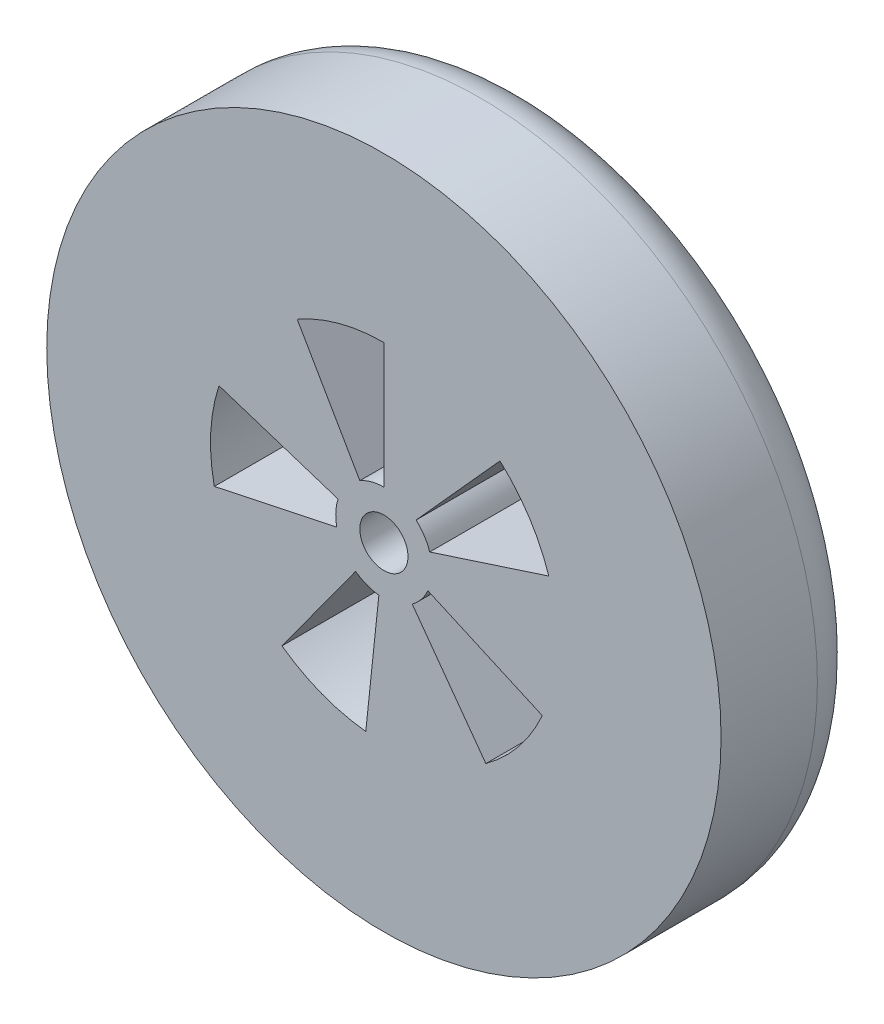
ISO-10303-21;
HEADER;
FILE_DESCRIPTION(('STEP AP214'),'2;1');
FILE_NAME('part.step','',(''),(''),'','','');
FILE_SCHEMA(('AUTOMOTIVE_DESIGN { 1 0 10303 214 1 1 1 1 }'));
ENDSEC;
DATA;
#1=APPLICATION_CONTEXT('core data for automotive mechanical design processes');
#2=APPLICATION_PROTOCOL_DEFINITION('international standard','automotive_design',2000,#1);
#3=PRODUCT_CONTEXT('',#1,'mechanical');
#4=PRODUCT('Part','Part','',(#3));
#5=PRODUCT_RELATED_PRODUCT_CATEGORY('part','',(#4));
#6=PRODUCT_DEFINITION_FORMATION('','',#4);
#7=PRODUCT_DEFINITION_CONTEXT('part definition',#1,'design');
#8=PRODUCT_DEFINITION('design','',#6,#7);
#9=PRODUCT_DEFINITION_SHAPE('','',#8);
#10=(LENGTH_UNIT() NAMED_UNIT(*) SI_UNIT(.MILLI.,.METRE.));
#11=(NAMED_UNIT(*) PLANE_ANGLE_UNIT() SI_UNIT($,.RADIAN.));
#12=(NAMED_UNIT(*) SI_UNIT($,.STERADIAN.) SOLID_ANGLE_UNIT());
#13=UNCERTAINTY_MEASURE_WITH_UNIT(LENGTH_MEASURE(1.E-05),#10,'distance_accuracy_value','');
#14=(GEOMETRIC_REPRESENTATION_CONTEXT(3) GLOBAL_UNCERTAINTY_ASSIGNED_CONTEXT((#13)) GLOBAL_UNIT_ASSIGNED_CONTEXT((#10,
#11,#12)) REPRESENTATION_CONTEXT('',''));
#15=CARTESIAN_POINT('',(0.,0.,0.));
#16=DIRECTION('',(0.,0.,1.));
#17=DIRECTION('',(1.,0.,0.));
#18=AXIS2_PLACEMENT_3D('',#15,#16,#17);
#19=CARTESIAN_POINT('',(0.,0.,15.));
#20=DIRECTION('',(0.,0.,-1.));
#21=DIRECTION('',(-1.,0.,0.));
#22=AXIS2_PLACEMENT_3D('',#19,#20,#21);
#23=CYLINDRICAL_SURFACE('',#22,35.);
#24=CARTESIAN_POINT('',(0.,0.,5.));
#25=DIRECTION('',(0.,0.,1.));
#26=DIRECTION('',(1.,0.,0.));
#27=AXIS2_PLACEMENT_3D('',#24,#25,#26);
#28=CIRCLE('',#27,35.);
#29=CARTESIAN_POINT('',(35.,0.,5.));
#30=VERTEX_POINT('',#29);
#31=EDGE_CURVE('E40',#30,#30,#28,.T.);
#32=ORIENTED_EDGE('',*,*,#31,.T.);
#33=EDGE_LOOP('',(#32));
#34=FACE_BOUND('',#33,.T.);
#35=CARTESIAN_POINT('',(0.,0.,15.));
#36=DIRECTION('',(0.,0.,1.));
#37=DIRECTION('',(1.,0.,0.));
#38=AXIS2_PLACEMENT_3D('',#35,#36,#37);
#39=CIRCLE('',#38,35.);
#40=CARTESIAN_POINT('',(35.,0.,15.));
#41=VERTEX_POINT('',#40);
#42=EDGE_CURVE('E345',#41,#41,#39,.T.);
#43=ORIENTED_EDGE('',*,*,#42,.F.);
#44=EDGE_LOOP('',(#43));
#45=FACE_BOUND('',#44,.T.);
#46=ADVANCED_FACE('F32',(#34,#45),#23,.T.);
#47=CARTESIAN_POINT('',(0.,0.,15.));
#48=DIRECTION('',(0.,0.,1.));
#49=DIRECTION('',(1.,0.,0.));
#50=AXIS2_PLACEMENT_3D('',#47,#48,#49);
#51=PLANE('',#50);
#52=CARTESIAN_POINT('',(0.,0.,15.));
#53=DIRECTION('',(0.,0.,1.));
#54=DIRECTION('',(1.,0.,0.));
#55=AXIS2_PLACEMENT_3D('',#52,#53,#54);
#56=CIRCLE('',#55,5.);
#57=CARTESIAN_POINT('',(4.75528258147575,1.54508497187479,15.));
#58=VERTEX_POINT('',#57);
#59=CARTESIAN_POINT('',(3.34565303179425,3.71572412738701,15.));
#60=VERTEX_POINT('',#59);
#61=EDGE_CURVE('E277',#58,#60,#56,.T.);
#62=ORIENTED_EDGE('',*,*,#61,.T.);
#63=DIRECTION('',(0.669130606358849,0.743144825477403,0.));
#64=VECTOR('',#63,1.);
#65=CARTESIAN_POINT('',(3.34565303179425,3.71572412738701,15.));
#66=LINE('',#65,#64);
#67=CARTESIAN_POINT('',(12.0443509144593,13.3766068585932,15.));
#68=VERTEX_POINT('',#67);
#69=EDGE_CURVE('E280',#60,#68,#66,.T.);
#70=ORIENTED_EDGE('',*,*,#69,.T.);
#71=CARTESIAN_POINT('',(0.,0.,15.));
#72=DIRECTION('',(0.,0.,-1.));
#73=DIRECTION('',(1.,0.,0.));
#74=AXIS2_PLACEMENT_3D('',#71,#72,#73);
#75=CIRCLE('',#74,18.);
#76=CARTESIAN_POINT('',(17.1190172933127,5.56230589874925,15.));
#77=VERTEX_POINT('',#76);
#78=EDGE_CURVE('E47',#68,#77,#75,.T.);
#79=ORIENTED_EDGE('',*,*,#78,.T.);
#80=DIRECTION('',(-0.95105651629515,-0.309016994374958,0.));
#81=VECTOR('',#80,1.);
#82=CARTESIAN_POINT('',(4.75528258147575,1.54508497187479,15.));
#83=LINE('',#82,#81);
#84=EDGE_CURVE('E285',#77,#58,#83,.T.);
#85=ORIENTED_EDGE('',*,*,#84,.T.);
#86=EDGE_LOOP('',(#62,#70,#79,#85));
#87=FACE_BOUND('',#86,.T.);
#88=CARTESIAN_POINT('',(0.,0.,15.));
#89=DIRECTION('',(0.,0.,1.));
#90=DIRECTION('',(1.,0.,0.));
#91=AXIS2_PLACEMENT_3D('',#88,#89,#90);
#92=CIRCLE('',#91,5.);
#93=CARTESIAN_POINT('',(2.9389262614624,-4.04508497187471,15.));
#94=VERTEX_POINT('',#93);
#95=CARTESIAN_POINT('',(4.56772728821303,-2.03368321537896,15.));
#96=VERTEX_POINT('',#95);
#97=EDGE_CURVE('E248',#94,#96,#92,.T.);
#98=ORIENTED_EDGE('',*,*,#97,.T.);
#99=DIRECTION('',(0.913545457642605,-0.406736643075791,0.));
#100=VECTOR('',#99,1.);
#101=CARTESIAN_POINT('',(4.56772728821303,-2.03368321537896,15.));
#102=LINE('',#101,#100);
#103=CARTESIAN_POINT('',(16.4438182375669,-7.32125957536424,15.));
#104=VERTEX_POINT('',#103);
#105=EDGE_CURVE('E251',#96,#104,#102,.T.);
#106=ORIENTED_EDGE('',*,*,#105,.T.);
#107=CARTESIAN_POINT('',(0.,0.,15.));
#108=DIRECTION('',(0.,0.,-1.));
#109=DIRECTION('',(1.,0.,0.));
#110=AXIS2_PLACEMENT_3D('',#107,#108,#109);
#111=CIRCLE('',#110,18.);
#112=CARTESIAN_POINT('',(10.5801345412646,-14.562305898749,15.));
#113=VERTEX_POINT('',#112);
#114=EDGE_CURVE('E55',#104,#113,#111,.T.);
#115=ORIENTED_EDGE('',*,*,#114,.T.);
#116=DIRECTION('',(-0.58778525229248,0.809016994374942,0.));
#117=VECTOR('',#116,1.);
#118=CARTESIAN_POINT('',(2.9389262614624,-4.04508497187471,15.));
#119=LINE('',#118,#117);
#120=EDGE_CURVE('E256',#113,#94,#119,.T.);
#121=ORIENTED_EDGE('',*,*,#120,.T.);
#122=EDGE_LOOP('',(#98,#106,#115,#121));
#123=FACE_BOUND('',#122,.T.);
#124=CARTESIAN_POINT('',(0.,0.,15.));
#125=DIRECTION('',(0.,0.,1.));
#126=DIRECTION('',(1.,0.,0.));
#127=AXIS2_PLACEMENT_3D('',#124,#125,#126);
#128=CIRCLE('',#127,5.);
#129=CARTESIAN_POINT('',(-2.93892626146234,-4.04508497187476,15.));
#130=VERTEX_POINT('',#129);
#131=CARTESIAN_POINT('',(-0.522642316338235,-4.97260947684137,15.));
#132=VERTEX_POINT('',#131);
#133=EDGE_CURVE('E216',#130,#132,#128,.T.);
#134=ORIENTED_EDGE('',*,*,#133,.T.);
#135=DIRECTION('',(-0.104528463267647,-0.994521895368274,0.));
#136=VECTOR('',#135,1.);
#137=CARTESIAN_POINT('',(-0.522642316338235,-4.97260947684137,15.));
#138=LINE('',#137,#136);
#139=CARTESIAN_POINT('',(-1.88151233881764,-17.9013941166289,15.));
#140=VERTEX_POINT('',#139);
#141=EDGE_CURVE('E219',#132,#140,#138,.T.);
#142=ORIENTED_EDGE('',*,*,#141,.T.);
#143=CARTESIAN_POINT('',(0.,0.,15.));
#144=DIRECTION('',(0.,0.,-1.));
#145=DIRECTION('',(1.,0.,0.));
#146=AXIS2_PLACEMENT_3D('',#143,#144,#145);
#147=CIRCLE('',#146,18.);
#148=CARTESIAN_POINT('',(-10.5801345412644,-14.5623058987491,15.));
#149=VERTEX_POINT('',#148);
#150=EDGE_CURVE('E223',#140,#149,#147,.T.);
#151=ORIENTED_EDGE('',*,*,#150,.T.);
#152=DIRECTION('',(0.587785252292469,0.809016994374951,0.));
#153=VECTOR('',#152,1.);
#154=CARTESIAN_POINT('',(-2.93892626146234,-4.04508497187476,15.));
#155=LINE('',#154,#153);
#156=EDGE_CURVE('E226',#149,#130,#155,.T.);
#157=ORIENTED_EDGE('',*,*,#156,.T.);
#158=EDGE_LOOP('',(#134,#142,#151,#157));
#159=FACE_BOUND('',#158,.T.);
#160=CARTESIAN_POINT('',(0.,0.,15.));
#161=DIRECTION('',(0.,0.,1.));
#162=DIRECTION('',(1.,0.,0.));
#163=AXIS2_PLACEMENT_3D('',#160,#161,#162);
#164=CIRCLE('',#163,5.);
#165=CARTESIAN_POINT('',(-4.75528258147577,1.54508497187472,15.));
#166=VERTEX_POINT('',#165);
#167=CARTESIAN_POINT('',(-4.89073800366903,-1.03955845408882,15.));
#168=VERTEX_POINT('',#167);
#169=EDGE_CURVE('E175',#166,#168,#164,.T.);
#170=ORIENTED_EDGE('',*,*,#169,.T.);
#171=DIRECTION('',(-0.978147600733805,-0.207911690817763,0.));
#172=VECTOR('',#171,1.);
#173=CARTESIAN_POINT('',(-4.89073800366903,-1.03955845408882,15.));
#174=LINE('',#173,#172);
#175=CARTESIAN_POINT('',(-17.6066568132085,-3.74241043471974,15.));
#176=VERTEX_POINT('',#175);
#177=EDGE_CURVE('E186',#168,#176,#174,.T.);
#178=ORIENTED_EDGE('',*,*,#177,.T.);
#179=CARTESIAN_POINT('',(0.,0.,15.));
#180=DIRECTION('',(0.,0.,-1.));
#181=DIRECTION('',(1.,0.,0.));
#182=AXIS2_PLACEMENT_3D('',#179,#180,#181);
#183=CIRCLE('',#182,18.);
#184=CARTESIAN_POINT('',(-17.1190172933128,5.56230589874901,15.));
#185=VERTEX_POINT('',#184);
#186=EDGE_CURVE('E191',#176,#185,#183,.T.);
#187=ORIENTED_EDGE('',*,*,#186,.T.);
#188=DIRECTION('',(0.951056516295154,-0.309016994374945,0.));
#189=VECTOR('',#188,1.);
#190=CARTESIAN_POINT('',(-4.75528258147577,1.54508497187472,15.));
#191=LINE('',#190,#189);
#192=EDGE_CURVE('E182',#185,#166,#191,.T.);
#193=ORIENTED_EDGE('',*,*,#192,.T.);
#194=EDGE_LOOP('',(#170,#178,#187,#193));
#195=FACE_BOUND('',#194,.T.);
#196=CARTESIAN_POINT('',(0.,0.,15.));
#197=DIRECTION('',(0.,0.,1.));
#198=DIRECTION('',(1.,0.,0.));
#199=AXIS2_PLACEMENT_3D('',#196,#197,#198);
#200=CIRCLE('',#199,5.);
#201=CARTESIAN_POINT('',(0.,5.,15.));
#202=VERTEX_POINT('',#201);
#203=CARTESIAN_POINT('',(-2.5,4.33012701892219,15.));
#204=VERTEX_POINT('',#203);
#205=EDGE_CURVE('E305',#202,#204,#200,.T.);
#206=ORIENTED_EDGE('',*,*,#205,.T.);
#207=DIRECTION('',(-0.500000000000001,0.866025403784438,0.));
#208=VECTOR('',#207,1.);
#209=CARTESIAN_POINT('',(-2.5,4.33012701892219,15.));
#210=LINE('',#209,#208);
#211=CARTESIAN_POINT('',(-9.00000000000002,15.5884572681199,15.));
#212=VERTEX_POINT('',#211);
#213=EDGE_CURVE('E308',#204,#212,#210,.T.);
#214=ORIENTED_EDGE('',*,*,#213,.T.);
#215=CARTESIAN_POINT('',(0.,0.,15.));
#216=DIRECTION('',(0.,0.,-1.));
#217=DIRECTION('',(1.,0.,0.));
#218=AXIS2_PLACEMENT_3D('',#215,#216,#217);
#219=CIRCLE('',#218,18.);
#220=CARTESIAN_POINT('',(0.,18.,15.));
#221=VERTEX_POINT('',#220);
#222=EDGE_CURVE('E312',#212,#221,#219,.T.);
#223=ORIENTED_EDGE('',*,*,#222,.T.);
#224=DIRECTION('',(0.,-1.,0.));
#225=VECTOR('',#224,1.);
#226=CARTESIAN_POINT('',(0.,5.,15.));
#227=LINE('',#226,#225);
#228=EDGE_CURVE('E315',#221,#202,#227,.T.);
#229=ORIENTED_EDGE('',*,*,#228,.T.);
#230=EDGE_LOOP('',(#206,#214,#223,#229));
#231=FACE_BOUND('',#230,.T.);
#232=CARTESIAN_POINT('',(0.,0.,15.));
#233=DIRECTION('',(0.,0.,-1.));
#234=DIRECTION('',(-1.,0.,0.));
#235=AXIS2_PLACEMENT_3D('',#232,#233,#234);
#236=CIRCLE('',#235,2.5);
#237=CARTESIAN_POINT('',(-2.5,0.,15.));
#238=VERTEX_POINT('',#237);
#239=EDGE_CURVE('E337',#238,#238,#236,.T.);
#240=ORIENTED_EDGE('',*,*,#239,.T.);
#241=EDGE_LOOP('',(#240));
#242=FACE_BOUND('',#241,.T.);
#243=ORIENTED_EDGE('',*,*,#42,.T.);
#244=EDGE_LOOP('',(#243));
#245=FACE_BOUND('',#244,.T.);
#246=ADVANCED_FACE('F193',(#87,#123,#159,#195,#231,#242,#245),#51,.T.);
#247=CARTESIAN_POINT('',(0.,0.,0.));
#248=DIRECTION('',(0.,0.,1.));
#249=DIRECTION('',(1.,0.,0.));
#250=AXIS2_PLACEMENT_3D('',#247,#248,#249);
#251=PLANE('',#250);
#252=CARTESIAN_POINT('',(0.,0.,0.));
#253=DIRECTION('',(0.,0.,1.));
#254=DIRECTION('',(1.,0.,0.));
#255=AXIS2_PLACEMENT_3D('',#252,#253,#254);
#256=CIRCLE('',#255,30.);
#257=CARTESIAN_POINT('',(30.,0.,0.));
#258=VERTEX_POINT('',#257);
#259=EDGE_CURVE('E11',#258,#258,#256,.F.);
#260=ORIENTED_EDGE('',*,*,#259,.T.);
#261=EDGE_LOOP('',(#260));
#262=FACE_BOUND('',#261,.T.);
#263=CARTESIAN_POINT('',(0.,0.,0.));
#264=DIRECTION('',(0.,0.,-1.));
#265=DIRECTION('',(-1.,0.,0.));
#266=AXIS2_PLACEMENT_3D('',#263,#264,#265);
#267=CIRCLE('',#266,20.);
#268=CARTESIAN_POINT('',(-20.,0.,0.));
#269=VERTEX_POINT('',#268);
#270=EDGE_CURVE('E340',#269,#269,#267,.T.);
#271=ORIENTED_EDGE('',*,*,#270,.F.);
#272=EDGE_LOOP('',(#271));
#273=FACE_BOUND('',#272,.T.);
#274=ADVANCED_FACE('F377',(#262,#273),#251,.F.);
#275=CARTESIAN_POINT('',(0.,0.,3.));
#276=DIRECTION('',(0.,0.,-1.));
#277=DIRECTION('',(-1.,0.,0.));
#278=AXIS2_PLACEMENT_3D('',#275,#276,#277);
#279=CYLINDRICAL_SURFACE('',#278,20.);
#280=CARTESIAN_POINT('',(0.,0.,1.));
#281=DIRECTION('',(0.,0.,-1.));
#282=DIRECTION('',(-1.,0.,0.));
#283=AXIS2_PLACEMENT_3D('',#280,#281,#282);
#284=CIRCLE('',#283,20.);
#285=CARTESIAN_POINT('',(-20.,0.,1.));
#286=VERTEX_POINT('',#285);
#287=EDGE_CURVE('E352',#286,#286,#284,.F.);
#288=ORIENTED_EDGE('',*,*,#287,.T.);
#289=EDGE_LOOP('',(#288));
#290=FACE_BOUND('',#289,.T.);
#291=ORIENTED_EDGE('',*,*,#270,.T.);
#292=EDGE_LOOP('',(#291));
#293=FACE_BOUND('',#292,.T.);
#294=ADVANCED_FACE('F393',(#290,#293),#279,.F.);
#295=CARTESIAN_POINT('',(0.,0.,3.));
#296=DIRECTION('',(0.,0.,-1.));
#297=DIRECTION('',(-1.,0.,0.));
#298=AXIS2_PLACEMENT_3D('',#295,#296,#297);
#299=PLANE('',#298);
#300=DIRECTION('',(-0.95105651629515,-0.309016994374958,0.));
#301=VECTOR('',#300,1.);
#302=CARTESIAN_POINT('',(4.75528258147575,1.54508497187479,3.));
#303=LINE('',#302,#301);
#304=CARTESIAN_POINT('',(17.1190172933127,5.56230589874925,3.));
#305=VERTEX_POINT('',#304);
#306=CARTESIAN_POINT('',(4.75528258147575,1.54508497187479,3.));
#307=VERTEX_POINT('',#306);
#308=EDGE_CURVE('E281',#305,#307,#303,.T.);
#309=ORIENTED_EDGE('',*,*,#308,.F.);
#310=CARTESIAN_POINT('',(0.,0.,3.));
#311=DIRECTION('',(0.,0.,-1.));
#312=DIRECTION('',(-1.,0.,0.));
#313=AXIS2_PLACEMENT_3D('',#310,#311,#312);
#314=CIRCLE('',#313,18.);
#315=CARTESIAN_POINT('',(16.4438182375669,-7.32125957536424,3.));
#316=VERTEX_POINT('',#315);
#317=EDGE_CURVE('E652',#305,#316,#314,.T.);
#318=ORIENTED_EDGE('',*,*,#317,.T.);
#319=DIRECTION('',(0.913545457642605,-0.406736643075791,0.));
#320=VECTOR('',#319,1.);
#321=CARTESIAN_POINT('',(4.56772728821303,-2.03368321537896,3.));
#322=LINE('',#321,#320);
#323=CARTESIAN_POINT('',(4.56772728821303,-2.03368321537896,3.));
#324=VERTEX_POINT('',#323);
#325=EDGE_CURVE('E263',#324,#316,#322,.T.);
#326=ORIENTED_EDGE('',*,*,#325,.F.);
#327=CARTESIAN_POINT('',(0.,0.,3.));
#328=DIRECTION('',(0.,0.,1.));
#329=DIRECTION('',(1.,0.,0.));
#330=AXIS2_PLACEMENT_3D('',#327,#328,#329);
#331=CIRCLE('',#330,5.);
#332=CARTESIAN_POINT('',(2.9389262614624,-4.04508497187471,3.));
#333=VERTEX_POINT('',#332);
#334=EDGE_CURVE('E260',#333,#324,#331,.T.);
#335=ORIENTED_EDGE('',*,*,#334,.F.);
#336=DIRECTION('',(-0.58778525229248,0.809016994374942,0.));
#337=VECTOR('',#336,1.);
#338=CARTESIAN_POINT('',(2.9389262614624,-4.04508497187471,3.));
#339=LINE('',#338,#337);
#340=CARTESIAN_POINT('',(10.5801345412646,-14.562305898749,3.));
#341=VERTEX_POINT('',#340);
#342=EDGE_CURVE('E252',#341,#333,#339,.T.);
#343=ORIENTED_EDGE('',*,*,#342,.F.);
#344=CARTESIAN_POINT('',(-1.88151233881764,-17.9013941166289,3.));
#345=VERTEX_POINT('',#344);
#346=EDGE_CURVE('E654',#341,#345,#314,.T.);
#347=ORIENTED_EDGE('',*,*,#346,.T.);
#348=DIRECTION('',(-0.104528463267647,-0.994521895368274,0.));
#349=VECTOR('',#348,1.);
#350=CARTESIAN_POINT('',(-0.522642316338235,-4.97260947684137,3.));
#351=LINE('',#350,#349);
#352=CARTESIAN_POINT('',(-0.522642316338235,-4.97260947684137,3.));
#353=VERTEX_POINT('',#352);
#354=EDGE_CURVE('E233',#353,#345,#351,.T.);
#355=ORIENTED_EDGE('',*,*,#354,.F.);
#356=CARTESIAN_POINT('',(0.,0.,3.));
#357=DIRECTION('',(0.,0.,1.));
#358=DIRECTION('',(1.,0.,0.));
#359=AXIS2_PLACEMENT_3D('',#356,#357,#358);
#360=CIRCLE('',#359,5.);
#361=CARTESIAN_POINT('',(-2.93892626146234,-4.04508497187476,3.));
#362=VERTEX_POINT('',#361);
#363=EDGE_CURVE('E230',#362,#353,#360,.T.);
#364=ORIENTED_EDGE('',*,*,#363,.F.);
#365=DIRECTION('',(0.587785252292469,0.809016994374951,0.));
#366=VECTOR('',#365,1.);
#367=CARTESIAN_POINT('',(-2.93892626146234,-4.04508497187476,3.));
#368=LINE('',#367,#366);
#369=CARTESIAN_POINT('',(-10.5801345412644,-14.5623058987491,3.));
#370=VERTEX_POINT('',#369);
#371=EDGE_CURVE('E220',#370,#362,#368,.T.);
#372=ORIENTED_EDGE('',*,*,#371,.F.);
#373=CARTESIAN_POINT('',(-17.6066568132085,-3.74241043471974,3.));
#374=VERTEX_POINT('',#373);
#375=EDGE_CURVE('E348',#370,#374,#314,.T.);
#376=ORIENTED_EDGE('',*,*,#375,.T.);
#377=DIRECTION('',(-0.978147600733805,-0.207911690817763,0.));
#378=VECTOR('',#377,1.);
#379=CARTESIAN_POINT('',(-4.89073800366903,-1.03955845408882,3.));
#380=LINE('',#379,#378);
#381=CARTESIAN_POINT('',(-4.89073800366903,-1.03955845408882,3.));
#382=VERTEX_POINT('',#381);
#383=EDGE_CURVE('E205',#382,#374,#380,.T.);
#384=ORIENTED_EDGE('',*,*,#383,.F.);
#385=CARTESIAN_POINT('',(0.,0.,3.));
#386=DIRECTION('',(0.,0.,1.));
#387=DIRECTION('',(1.,0.,0.));
#388=AXIS2_PLACEMENT_3D('',#385,#386,#387);
#389=CIRCLE('',#388,5.);
#390=CARTESIAN_POINT('',(-4.75528258147577,1.54508497187472,3.));
#391=VERTEX_POINT('',#390);
#392=EDGE_CURVE('E178',#391,#382,#389,.T.);
#393=ORIENTED_EDGE('',*,*,#392,.F.);
#394=DIRECTION('',(0.951056516295154,-0.309016994374945,0.));
#395=VECTOR('',#394,1.);
#396=CARTESIAN_POINT('',(-4.75528258147577,1.54508497187472,3.));
#397=LINE('',#396,#395);
#398=CARTESIAN_POINT('',(-17.1190172933128,5.56230589874901,3.));
#399=VERTEX_POINT('',#398);
#400=EDGE_CURVE('E196',#399,#391,#397,.T.);
#401=ORIENTED_EDGE('',*,*,#400,.F.);
#402=CARTESIAN_POINT('',(-9.00000000000002,15.5884572681199,3.));
#403=VERTEX_POINT('',#402);
#404=EDGE_CURVE('E349',#399,#403,#314,.T.);
#405=ORIENTED_EDGE('',*,*,#404,.T.);
#406=DIRECTION('',(-0.500000000000001,0.866025403784438,0.));
#407=VECTOR('',#406,1.);
#408=CARTESIAN_POINT('',(-2.5,4.33012701892219,3.));
#409=LINE('',#408,#407);
#410=CARTESIAN_POINT('',(-2.5,4.33012701892219,3.));
#411=VERTEX_POINT('',#410);
#412=EDGE_CURVE('E321',#411,#403,#409,.T.);
#413=ORIENTED_EDGE('',*,*,#412,.F.);
#414=CARTESIAN_POINT('',(0.,0.,3.));
#415=DIRECTION('',(0.,0.,1.));
#416=DIRECTION('',(1.,0.,0.));
#417=AXIS2_PLACEMENT_3D('',#414,#415,#416);
#418=CIRCLE('',#417,5.);
#419=CARTESIAN_POINT('',(0.,5.,3.));
#420=VERTEX_POINT('',#419);
#421=EDGE_CURVE('E212',#420,#411,#418,.T.);
#422=ORIENTED_EDGE('',*,*,#421,.F.);
#423=DIRECTION('',(0.,-1.,0.));
#424=VECTOR('',#423,1.);
#425=CARTESIAN_POINT('',(0.,5.,3.));
#426=LINE('',#425,#424);
#427=CARTESIAN_POINT('',(0.,18.,3.));
#428=VERTEX_POINT('',#427);
#429=EDGE_CURVE('E309',#428,#420,#426,.T.);
#430=ORIENTED_EDGE('',*,*,#429,.F.);
#431=CARTESIAN_POINT('',(12.0443509144593,13.3766068585932,3.));
#432=VERTEX_POINT('',#431);
#433=EDGE_CURVE('E353',#428,#432,#314,.T.);
#434=ORIENTED_EDGE('',*,*,#433,.T.);
#435=DIRECTION('',(0.669130606358849,0.743144825477403,0.));
#436=VECTOR('',#435,1.);
#437=CARTESIAN_POINT('',(3.34565303179425,3.71572412738701,3.));
#438=LINE('',#437,#436);
#439=CARTESIAN_POINT('',(3.34565303179425,3.71572412738701,3.));
#440=VERTEX_POINT('',#439);
#441=EDGE_CURVE('E292',#440,#432,#438,.T.);
#442=ORIENTED_EDGE('',*,*,#441,.F.);
#443=CARTESIAN_POINT('',(0.,0.,3.));
#444=DIRECTION('',(0.,0.,1.));
#445=DIRECTION('',(1.,0.,0.));
#446=AXIS2_PLACEMENT_3D('',#443,#444,#445);
#447=CIRCLE('',#446,5.);
#448=EDGE_CURVE('E289',#307,#440,#447,.T.);
#449=ORIENTED_EDGE('',*,*,#448,.F.);
#450=EDGE_LOOP('',(#309,#318,#326,#335,#343,#347,#355,#364,#372,#376,#384,#393,#401,#405,#413,
#422,#430,#434,#442,#449));
#451=FACE_BOUND('',#450,.T.);
#452=CARTESIAN_POINT('',(0.,0.,3.));
#453=DIRECTION('',(0.,0.,-1.));
#454=DIRECTION('',(-1.,0.,0.));
#455=AXIS2_PLACEMENT_3D('',#452,#453,#454);
#456=CIRCLE('',#455,2.5);
#457=CARTESIAN_POINT('',(-2.5,0.,3.));
#458=VERTEX_POINT('',#457);
#459=EDGE_CURVE('E330',#458,#458,#456,.T.);
#460=ORIENTED_EDGE('',*,*,#459,.F.);
#461=EDGE_LOOP('',(#460));
#462=FACE_BOUND('',#461,.T.);
#463=ADVANCED_FACE('F384',(#451,#462),#299,.T.);
#464=CARTESIAN_POINT('',(0.,0.,1.));
#465=DIRECTION('',(0.,0.,-1.));
#466=DIRECTION('',(-1.,0.,0.));
#467=AXIS2_PLACEMENT_3D('',#464,#465,#466);
#468=TOROIDAL_SURFACE('',#467,18.,2.);
#469=ORIENTED_EDGE('',*,*,#287,.F.);
#470=EDGE_LOOP('',(#469));
#471=FACE_BOUND('',#470,.T.);
#472=ORIENTED_EDGE('',*,*,#404,.F.);
#473=CARTESIAN_POINT('',(0.,0.,3.));
#474=DIRECTION('',(0.,0.,-1.));
#475=DIRECTION('',(1.,0.,0.));
#476=AXIS2_PLACEMENT_3D('',#473,#474,#475);
#477=CIRCLE('',#476,18.);
#478=EDGE_CURVE('E199',#374,#399,#477,.T.);
#479=ORIENTED_EDGE('',*,*,#478,.F.);
#480=ORIENTED_EDGE('',*,*,#375,.F.);
#481=CARTESIAN_POINT('',(0.,0.,3.));
#482=DIRECTION('',(0.,0.,-1.));
#483=DIRECTION('',(1.,0.,0.));
#484=AXIS2_PLACEMENT_3D('',#481,#482,#483);
#485=CIRCLE('',#484,18.);
#486=EDGE_CURVE('E236',#345,#370,#485,.T.);
#487=ORIENTED_EDGE('',*,*,#486,.F.);
#488=ORIENTED_EDGE('',*,*,#346,.F.);
#489=CARTESIAN_POINT('',(0.,0.,3.));
#490=DIRECTION('',(0.,0.,-1.));
#491=DIRECTION('',(1.,0.,0.));
#492=AXIS2_PLACEMENT_3D('',#489,#490,#491);
#493=CIRCLE('',#492,18.);
#494=EDGE_CURVE('E266',#316,#341,#493,.T.);
#495=ORIENTED_EDGE('',*,*,#494,.F.);
#496=ORIENTED_EDGE('',*,*,#317,.F.);
#497=CARTESIAN_POINT('',(0.,0.,3.));
#498=DIRECTION('',(0.,0.,-1.));
#499=DIRECTION('',(1.,0.,0.));
#500=AXIS2_PLACEMENT_3D('',#497,#498,#499);
#501=CIRCLE('',#500,18.);
#502=EDGE_CURVE('E294',#432,#305,#501,.T.);
#503=ORIENTED_EDGE('',*,*,#502,.F.);
#504=ORIENTED_EDGE('',*,*,#433,.F.);
#505=CARTESIAN_POINT('',(0.,0.,3.));
#506=DIRECTION('',(0.,0.,-1.));
#507=DIRECTION('',(1.,0.,0.));
#508=AXIS2_PLACEMENT_3D('',#505,#506,#507);
#509=CIRCLE('',#508,18.);
#510=EDGE_CURVE('E323',#403,#428,#509,.T.);
#511=ORIENTED_EDGE('',*,*,#510,.F.);
#512=EDGE_LOOP('',(#472,#479,#480,#487,#488,#495,#496,#503,#504,#511));
#513=FACE_BOUND('',#512,.T.);
#514=ADVANCED_FACE('F381',(#471,#513),#468,.F.);
#515=CARTESIAN_POINT('',(0.,0.,15.));
#516=DIRECTION('',(0.,0.,-1.));
#517=DIRECTION('',(-1.,0.,0.));
#518=AXIS2_PLACEMENT_3D('',#515,#516,#517);
#519=CYLINDRICAL_SURFACE('',#518,2.5);
#520=ORIENTED_EDGE('',*,*,#239,.F.);
#521=EDGE_LOOP('',(#520));
#522=FACE_BOUND('',#521,.T.);
#523=ORIENTED_EDGE('',*,*,#459,.T.);
#524=EDGE_LOOP('',(#523));
#525=FACE_BOUND('',#524,.T.);
#526=ADVANCED_FACE('F383',(#522,#525),#519,.F.);
#527=CARTESIAN_POINT('',(0.,0.,15.));
#528=DIRECTION('',(0.,0.,-1.));
#529=DIRECTION('',(-1.,0.,0.));
#530=AXIS2_PLACEMENT_3D('',#527,#528,#529);
#531=CYLINDRICAL_SURFACE('',#530,5.);
#532=ORIENTED_EDGE('',*,*,#421,.T.);
#533=DIRECTION('',(0.,0.,-1.));
#534=VECTOR('',#533,1.);
#535=CARTESIAN_POINT('',(-2.5,4.33012701892219,15.));
#536=LINE('',#535,#534);
#537=EDGE_CURVE('E318',#204,#411,#536,.T.);
#538=ORIENTED_EDGE('',*,*,#537,.F.);
#539=ORIENTED_EDGE('',*,*,#205,.F.);
#540=DIRECTION('',(0.,0.,-1.));
#541=VECTOR('',#540,1.);
#542=CARTESIAN_POINT('',(0.,5.,15.));
#543=LINE('',#542,#541);
#544=EDGE_CURVE('E328',#202,#420,#543,.T.);
#545=ORIENTED_EDGE('',*,*,#544,.T.);
#546=EDGE_LOOP('',(#532,#538,#539,#545));
#547=FACE_BOUND('',#546,.T.);
#548=ADVANCED_FACE('F390',(#547),#531,.T.);
#549=CARTESIAN_POINT('',(0.,5.,15.));
#550=DIRECTION('',(1.,0.,0.));
#551=DIRECTION('',(0.,0.,-1.));
#552=AXIS2_PLACEMENT_3D('',#549,#550,#551);
#553=PLANE('',#552);
#554=ORIENTED_EDGE('',*,*,#429,.T.);
#555=ORIENTED_EDGE('',*,*,#544,.F.);
#556=ORIENTED_EDGE('',*,*,#228,.F.);
#557=DIRECTION('',(0.,0.,-1.));
#558=VECTOR('',#557,1.);
#559=CARTESIAN_POINT('',(0.,18.,15.));
#560=LINE('',#559,#558);
#561=EDGE_CURVE('E331',#221,#428,#560,.T.);
#562=ORIENTED_EDGE('',*,*,#561,.T.);
#563=EDGE_LOOP('',(#554,#555,#556,#562));
#564=FACE_BOUND('',#563,.T.);
#565=ADVANCED_FACE('F466',(#564),#553,.F.);
#566=CARTESIAN_POINT('',(0.,0.,15.));
#567=DIRECTION('',(0.,0.,-1.));
#568=DIRECTION('',(-1.,0.,0.));
#569=AXIS2_PLACEMENT_3D('',#566,#567,#568);
#570=CYLINDRICAL_SURFACE('',#569,18.);
#571=ORIENTED_EDGE('',*,*,#510,.T.);
#572=ORIENTED_EDGE('',*,*,#561,.F.);
#573=ORIENTED_EDGE('',*,*,#222,.F.);
#574=DIRECTION('',(0.,0.,-1.));
#575=VECTOR('',#574,1.);
#576=CARTESIAN_POINT('',(-9.00000000000002,15.5884572681199,15.));
#577=LINE('',#576,#575);
#578=EDGE_CURVE('E333',#212,#403,#577,.T.);
#579=ORIENTED_EDGE('',*,*,#578,.T.);
#580=EDGE_LOOP('',(#571,#572,#573,#579));
#581=FACE_BOUND('',#580,.T.);
#582=ADVANCED_FACE('F469',(#581),#570,.F.);
#583=CARTESIAN_POINT('',(-2.5,4.33012701892219,15.));
#584=DIRECTION('',(-0.866025403784438,-0.500000000000001,0.));
#585=DIRECTION('',(0.500000000000001,-0.866025403784438,0.));
#586=AXIS2_PLACEMENT_3D('',#583,#584,#585);
#587=PLANE('',#586);
#588=ORIENTED_EDGE('',*,*,#412,.T.);
#589=ORIENTED_EDGE('',*,*,#578,.F.);
#590=ORIENTED_EDGE('',*,*,#213,.F.);
#591=ORIENTED_EDGE('',*,*,#537,.T.);
#592=EDGE_LOOP('',(#588,#589,#590,#591));
#593=FACE_BOUND('',#592,.T.);
#594=ADVANCED_FACE('F425',(#593),#587,.F.);
#595=CARTESIAN_POINT('',(0.,0.,15.));
#596=DIRECTION('',(0.,0.,-1.));
#597=DIRECTION('',(-1.,0.,0.));
#598=AXIS2_PLACEMENT_3D('',#595,#596,#597);
#599=CYLINDRICAL_SURFACE('',#598,5.);
#600=ORIENTED_EDGE('',*,*,#392,.T.);
#601=DIRECTION('',(0.,0.,-1.));
#602=VECTOR('',#601,1.);
#603=CARTESIAN_POINT('',(-4.89073800366903,-1.03955845408882,15.));
#604=LINE('',#603,#602);
#605=EDGE_CURVE('E171',#168,#382,#604,.T.);
#606=ORIENTED_EDGE('',*,*,#605,.F.);
#607=ORIENTED_EDGE('',*,*,#169,.F.);
#608=DIRECTION('',(0.,0.,-1.));
#609=VECTOR('',#608,1.);
#610=CARTESIAN_POINT('',(-4.75528258147577,1.54508497187472,15.));
#611=LINE('',#610,#609);
#612=EDGE_CURVE('E210',#166,#391,#611,.T.);
#613=ORIENTED_EDGE('',*,*,#612,.T.);
#614=EDGE_LOOP('',(#600,#606,#607,#613));
#615=FACE_BOUND('',#614,.T.);
#616=ADVANCED_FACE('F173',(#615),#599,.T.);
#617=CARTESIAN_POINT('',(-4.75528258147577,1.54508497187472,15.));
#618=DIRECTION('',(0.309016994374945,0.951056516295154,0.));
#619=DIRECTION('',(-0.951056516295155,0.309016994374945,0.));
#620=AXIS2_PLACEMENT_3D('',#617,#618,#619);
#621=PLANE('',#620);
#622=ORIENTED_EDGE('',*,*,#400,.T.);
#623=ORIENTED_EDGE('',*,*,#612,.F.);
#624=ORIENTED_EDGE('',*,*,#192,.F.);
#625=DIRECTION('',(0.,0.,-1.));
#626=VECTOR('',#625,1.);
#627=CARTESIAN_POINT('',(-17.1190172933128,5.56230589874901,15.));
#628=LINE('',#627,#626);
#629=EDGE_CURVE('E213',#185,#399,#628,.T.);
#630=ORIENTED_EDGE('',*,*,#629,.T.);
#631=EDGE_LOOP('',(#622,#623,#624,#630));
#632=FACE_BOUND('',#631,.T.);
#633=ADVANCED_FACE('F410',(#632),#621,.F.);
#634=CARTESIAN_POINT('',(0.,0.,15.));
#635=DIRECTION('',(0.,0.,-1.));
#636=DIRECTION('',(-1.,0.,0.));
#637=AXIS2_PLACEMENT_3D('',#634,#635,#636);
#638=CYLINDRICAL_SURFACE('',#637,18.);
#639=ORIENTED_EDGE('',*,*,#478,.T.);
#640=ORIENTED_EDGE('',*,*,#629,.F.);
#641=ORIENTED_EDGE('',*,*,#186,.F.);
#642=DIRECTION('',(0.,0.,-1.));
#643=VECTOR('',#642,1.);
#644=CARTESIAN_POINT('',(-17.6066568132085,-3.74241043471973,15.));
#645=LINE('',#644,#643);
#646=EDGE_CURVE('E181',#176,#374,#645,.T.);
#647=ORIENTED_EDGE('',*,*,#646,.T.);
#648=EDGE_LOOP('',(#639,#640,#641,#647));
#649=FACE_BOUND('',#648,.T.);
#650=ADVANCED_FACE('F412',(#649),#638,.F.);
#651=CARTESIAN_POINT('',(-4.89073800366903,-1.03955845408882,15.));
#652=DIRECTION('',(0.207911690817763,-0.978147600733805,0.));
#653=DIRECTION('',(0.978147600733805,0.207911690817763,0.));
#654=AXIS2_PLACEMENT_3D('',#651,#652,#653);
#655=PLANE('',#654);
#656=ORIENTED_EDGE('',*,*,#383,.T.);
#657=ORIENTED_EDGE('',*,*,#646,.F.);
#658=ORIENTED_EDGE('',*,*,#177,.F.);
#659=ORIENTED_EDGE('',*,*,#605,.T.);
#660=EDGE_LOOP('',(#656,#657,#658,#659));
#661=FACE_BOUND('',#660,.T.);
#662=ADVANCED_FACE('F187',(#661),#655,.F.);
#663=CARTESIAN_POINT('',(0.,0.,15.));
#664=DIRECTION('',(0.,0.,-1.));
#665=DIRECTION('',(-1.,0.,0.));
#666=AXIS2_PLACEMENT_3D('',#663,#664,#665);
#667=CYLINDRICAL_SURFACE('',#666,5.);
#668=ORIENTED_EDGE('',*,*,#363,.T.);
#669=DIRECTION('',(0.,0.,-1.));
#670=VECTOR('',#669,1.);
#671=CARTESIAN_POINT('',(-0.522642316338235,-4.97260947684137,15.));
#672=LINE('',#671,#670);
#673=EDGE_CURVE('E229',#132,#353,#672,.T.);
#674=ORIENTED_EDGE('',*,*,#673,.F.);
#675=ORIENTED_EDGE('',*,*,#133,.F.);
#676=DIRECTION('',(0.,0.,-1.));
#677=VECTOR('',#676,1.);
#678=CARTESIAN_POINT('',(-2.93892626146234,-4.04508497187476,15.));
#679=LINE('',#678,#677);
#680=EDGE_CURVE('E206',#130,#362,#679,.T.);
#681=ORIENTED_EDGE('',*,*,#680,.T.);
#682=EDGE_LOOP('',(#668,#674,#675,#681));
#683=FACE_BOUND('',#682,.T.);
#684=ADVANCED_FACE('F419',(#683),#667,.T.);
#685=CARTESIAN_POINT('',(-2.93892626146234,-4.04508497187476,15.));
#686=DIRECTION('',(-0.809016994374951,0.587785252292468,0.));
#687=DIRECTION('',(-0.587785252292469,-0.809016994374951,0.));
#688=AXIS2_PLACEMENT_3D('',#685,#686,#687);
#689=PLANE('',#688);
#690=ORIENTED_EDGE('',*,*,#371,.T.);
#691=ORIENTED_EDGE('',*,*,#680,.F.);
#692=ORIENTED_EDGE('',*,*,#156,.F.);
#693=DIRECTION('',(0.,0.,-1.));
#694=VECTOR('',#693,1.);
#695=CARTESIAN_POINT('',(-10.5801345412644,-14.5623058987491,15.));
#696=LINE('',#695,#694);
#697=EDGE_CURVE('E242',#149,#370,#696,.T.);
#698=ORIENTED_EDGE('',*,*,#697,.T.);
#699=EDGE_LOOP('',(#690,#691,#692,#698));
#700=FACE_BOUND('',#699,.T.);
#701=ADVANCED_FACE('F426',(#700),#689,.F.);
#702=CARTESIAN_POINT('',(0.,0.,15.));
#703=DIRECTION('',(0.,0.,-1.));
#704=DIRECTION('',(-1.,0.,0.));
#705=AXIS2_PLACEMENT_3D('',#702,#703,#704);
#706=CYLINDRICAL_SURFACE('',#705,18.);
#707=ORIENTED_EDGE('',*,*,#486,.T.);
#708=ORIENTED_EDGE('',*,*,#697,.F.);
#709=ORIENTED_EDGE('',*,*,#150,.F.);
#710=DIRECTION('',(0.,0.,-1.));
#711=VECTOR('',#710,1.);
#712=CARTESIAN_POINT('',(-1.88151233881765,-17.9013941166289,15.));
#713=LINE('',#712,#711);
#714=EDGE_CURVE('E244',#140,#345,#713,.T.);
#715=ORIENTED_EDGE('',*,*,#714,.T.);
#716=EDGE_LOOP('',(#707,#708,#709,#715));
#717=FACE_BOUND('',#716,.T.);
#718=ADVANCED_FACE('F429',(#717),#706,.F.);
#719=CARTESIAN_POINT('',(-0.522642316338235,-4.97260947684137,15.));
#720=DIRECTION('',(0.994521895368274,-0.104528463267647,0.));
#721=DIRECTION('',(0.104528463267647,0.994521895368274,0.));
#722=AXIS2_PLACEMENT_3D('',#719,#720,#721);
#723=PLANE('',#722);
#724=ORIENTED_EDGE('',*,*,#354,.T.);
#725=ORIENTED_EDGE('',*,*,#714,.F.);
#726=ORIENTED_EDGE('',*,*,#141,.F.);
#727=ORIENTED_EDGE('',*,*,#673,.T.);
#728=EDGE_LOOP('',(#724,#725,#726,#727));
#729=FACE_BOUND('',#728,.T.);
#730=ADVANCED_FACE('F433',(#729),#723,.F.);
#731=CARTESIAN_POINT('',(0.,0.,15.));
#732=DIRECTION('',(0.,0.,-1.));
#733=DIRECTION('',(-1.,0.,0.));
#734=AXIS2_PLACEMENT_3D('',#731,#732,#733);
#735=CYLINDRICAL_SURFACE('',#734,5.);
#736=ORIENTED_EDGE('',*,*,#334,.T.);
#737=DIRECTION('',(0.,0.,-1.));
#738=VECTOR('',#737,1.);
#739=CARTESIAN_POINT('',(4.56772728821303,-2.03368321537896,15.));
#740=LINE('',#739,#738);
#741=EDGE_CURVE('E259',#96,#324,#740,.T.);
#742=ORIENTED_EDGE('',*,*,#741,.F.);
#743=ORIENTED_EDGE('',*,*,#97,.F.);
#744=DIRECTION('',(0.,0.,-1.));
#745=VECTOR('',#744,1.);
#746=CARTESIAN_POINT('',(2.9389262614624,-4.04508497187471,15.));
#747=LINE('',#746,#745);
#748=EDGE_CURVE('E234',#94,#333,#747,.T.);
#749=ORIENTED_EDGE('',*,*,#748,.T.);
#750=EDGE_LOOP('',(#736,#742,#743,#749));
#751=FACE_BOUND('',#750,.T.);
#752=ADVANCED_FACE('F437',(#751),#735,.T.);
#753=CARTESIAN_POINT('',(2.9389262614624,-4.04508497187471,15.));
#754=DIRECTION('',(-0.809016994374942,-0.58778525229248,0.));
#755=DIRECTION('',(0.58778525229248,-0.809016994374942,0.));
#756=AXIS2_PLACEMENT_3D('',#753,#754,#755);
#757=PLANE('',#756);
#758=ORIENTED_EDGE('',*,*,#342,.T.);
#759=ORIENTED_EDGE('',*,*,#748,.F.);
#760=ORIENTED_EDGE('',*,*,#120,.F.);
#761=DIRECTION('',(0.,0.,-1.));
#762=VECTOR('',#761,1.);
#763=CARTESIAN_POINT('',(10.5801345412646,-14.562305898749,15.));
#764=LINE('',#763,#762);
#765=EDGE_CURVE('E272',#113,#341,#764,.T.);
#766=ORIENTED_EDGE('',*,*,#765,.T.);
#767=EDGE_LOOP('',(#758,#759,#760,#766));
#768=FACE_BOUND('',#767,.T.);
#769=ADVANCED_FACE('F442',(#768),#757,.F.);
#770=CARTESIAN_POINT('',(0.,0.,15.));
#771=DIRECTION('',(0.,0.,-1.));
#772=DIRECTION('',(-1.,0.,0.));
#773=AXIS2_PLACEMENT_3D('',#770,#771,#772);
#774=CYLINDRICAL_SURFACE('',#773,18.);
#775=ORIENTED_EDGE('',*,*,#494,.T.);
#776=ORIENTED_EDGE('',*,*,#765,.F.);
#777=ORIENTED_EDGE('',*,*,#114,.F.);
#778=DIRECTION('',(0.,0.,-1.));
#779=VECTOR('',#778,1.);
#780=CARTESIAN_POINT('',(16.4438182375669,-7.32125957536424,15.));
#781=LINE('',#780,#779);
#782=EDGE_CURVE('E274',#104,#316,#781,.T.);
#783=ORIENTED_EDGE('',*,*,#782,.T.);
#784=EDGE_LOOP('',(#775,#776,#777,#783));
#785=FACE_BOUND('',#784,.T.);
#786=ADVANCED_FACE('F445',(#785),#774,.F.);
#787=CARTESIAN_POINT('',(4.56772728821303,-2.03368321537896,15.));
#788=DIRECTION('',(0.406736643075791,0.913545457642605,0.));
#789=DIRECTION('',(-0.913545457642605,0.406736643075791,0.));
#790=AXIS2_PLACEMENT_3D('',#787,#788,#789);
#791=PLANE('',#790);
#792=ORIENTED_EDGE('',*,*,#325,.T.);
#793=ORIENTED_EDGE('',*,*,#782,.F.);
#794=ORIENTED_EDGE('',*,*,#105,.F.);
#795=ORIENTED_EDGE('',*,*,#741,.T.);
#796=EDGE_LOOP('',(#792,#793,#794,#795));
#797=FACE_BOUND('',#796,.T.);
#798=ADVANCED_FACE('F449',(#797),#791,.F.);
#799=CARTESIAN_POINT('',(0.,0.,15.));
#800=DIRECTION('',(0.,0.,-1.));
#801=DIRECTION('',(-1.,0.,0.));
#802=AXIS2_PLACEMENT_3D('',#799,#800,#801);
#803=CYLINDRICAL_SURFACE('',#802,5.);
#804=ORIENTED_EDGE('',*,*,#448,.T.);
#805=DIRECTION('',(0.,0.,-1.));
#806=VECTOR('',#805,1.);
#807=CARTESIAN_POINT('',(3.34565303179425,3.71572412738701,15.));
#808=LINE('',#807,#806);
#809=EDGE_CURVE('E288',#60,#440,#808,.T.);
#810=ORIENTED_EDGE('',*,*,#809,.F.);
#811=ORIENTED_EDGE('',*,*,#61,.F.);
#812=DIRECTION('',(0.,0.,-1.));
#813=VECTOR('',#812,1.);
#814=CARTESIAN_POINT('',(4.75528258147575,1.54508497187479,15.));
#815=LINE('',#814,#813);
#816=EDGE_CURVE('E264',#58,#307,#815,.T.);
#817=ORIENTED_EDGE('',*,*,#816,.T.);
#818=EDGE_LOOP('',(#804,#810,#811,#817));
#819=FACE_BOUND('',#818,.T.);
#820=ADVANCED_FACE('F452',(#819),#803,.T.);
#821=CARTESIAN_POINT('',(4.75528258147575,1.54508497187479,15.));
#822=DIRECTION('',(0.309016994374958,-0.95105651629515,0.));
#823=DIRECTION('',(0.95105651629515,0.309016994374958,0.));
#824=AXIS2_PLACEMENT_3D('',#821,#822,#823);
#825=PLANE('',#824);
#826=ORIENTED_EDGE('',*,*,#308,.T.);
#827=ORIENTED_EDGE('',*,*,#816,.F.);
#828=ORIENTED_EDGE('',*,*,#84,.F.);
#829=DIRECTION('',(0.,0.,-1.));
#830=VECTOR('',#829,1.);
#831=CARTESIAN_POINT('',(17.1190172933127,5.56230589874925,15.));
#832=LINE('',#831,#830);
#833=EDGE_CURVE('E300',#77,#305,#832,.T.);
#834=ORIENTED_EDGE('',*,*,#833,.T.);
#835=EDGE_LOOP('',(#826,#827,#828,#834));
#836=FACE_BOUND('',#835,.T.);
#837=ADVANCED_FACE('F457',(#836),#825,.F.);
#838=CARTESIAN_POINT('',(0.,0.,15.));
#839=DIRECTION('',(0.,0.,-1.));
#840=DIRECTION('',(-1.,0.,0.));
#841=AXIS2_PLACEMENT_3D('',#838,#839,#840);
#842=CYLINDRICAL_SURFACE('',#841,18.);
#843=ORIENTED_EDGE('',*,*,#502,.T.);
#844=ORIENTED_EDGE('',*,*,#833,.F.);
#845=ORIENTED_EDGE('',*,*,#78,.F.);
#846=DIRECTION('',(0.,0.,-1.));
#847=VECTOR('',#846,1.);
#848=CARTESIAN_POINT('',(12.0443509144593,13.3766068585932,15.));
#849=LINE('',#848,#847);
#850=EDGE_CURVE('E302',#68,#432,#849,.T.);
#851=ORIENTED_EDGE('',*,*,#850,.T.);
#852=EDGE_LOOP('',(#843,#844,#845,#851));
#853=FACE_BOUND('',#852,.T.);
#854=ADVANCED_FACE('F366',(#853),#842,.F.);
#855=CARTESIAN_POINT('',(3.34565303179425,3.71572412738701,15.));
#856=DIRECTION('',(-0.743144825477403,0.669130606358849,0.));
#857=DIRECTION('',(-0.669130606358849,-0.743144825477403,0.));
#858=AXIS2_PLACEMENT_3D('',#855,#856,#857);
#859=PLANE('',#858);
#860=ORIENTED_EDGE('',*,*,#441,.T.);
#861=ORIENTED_EDGE('',*,*,#850,.F.);
#862=ORIENTED_EDGE('',*,*,#69,.F.);
#863=ORIENTED_EDGE('',*,*,#809,.T.);
#864=EDGE_LOOP('',(#860,#861,#862,#863));
#865=FACE_BOUND('',#864,.T.);
#866=ADVANCED_FACE('F361',(#865),#859,.F.);
#867=CARTESIAN_POINT('',(0.,0.,5.));
#868=DIRECTION('',(0.,0.,1.));
#869=DIRECTION('',(1.,0.,0.));
#870=AXIS2_PLACEMENT_3D('',#867,#868,#869);
#871=TOROIDAL_SURFACE('',#870,30.,5.);
#872=ORIENTED_EDGE('',*,*,#259,.F.);
#873=EDGE_LOOP('',(#872));
#874=FACE_BOUND('',#873,.T.);
#875=ORIENTED_EDGE('',*,*,#31,.F.);
#876=EDGE_LOOP('',(#875));
#877=FACE_BOUND('',#876,.T.);
#878=ADVANCED_FACE('F34',(#874,#877),#871,.T.);
#879=CLOSED_SHELL('',(#46,#246,#274,#294,#463,#514,#526,#548,#565,#582,#594,#616,#633,#650,#662,
#684,#701,#718,#730,#752,#769,#786,#798,#820,#837,#854,#866,#878));
#880=MANIFOLD_SOLID_BREP('B2',#879);
#881=ADVANCED_BREP_SHAPE_REPRESENTATION('',(#18,#880),#14);
#882=SHAPE_DEFINITION_REPRESENTATION(#9,#881);
ENDSEC;
END-ISO-10303-21;
